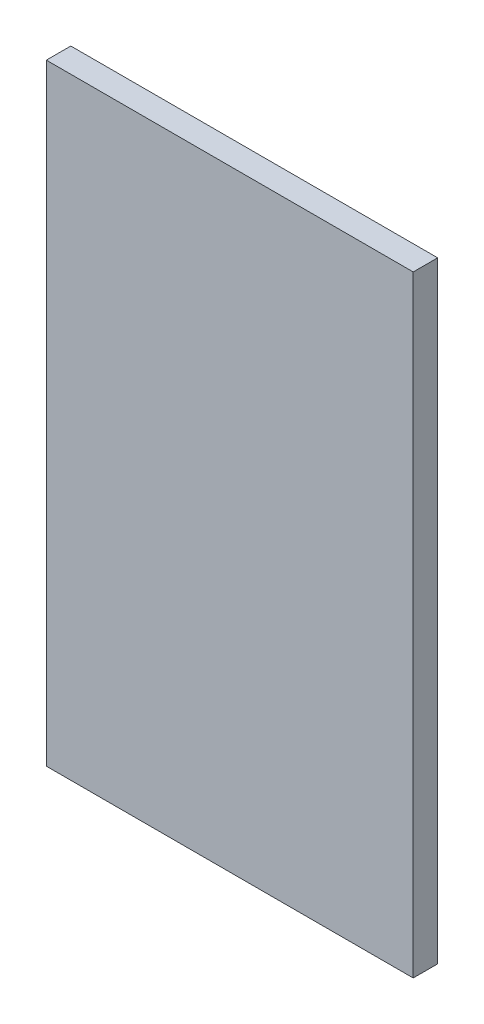
ISO-10303-21;
HEADER;
FILE_DESCRIPTION(('STEP AP214'),'2;1');
FILE_NAME('part.step','',(''),(''),'','','');
FILE_SCHEMA(('AUTOMOTIVE_DESIGN { 1 0 10303 214 1 1 1 1 }'));
ENDSEC;
DATA;
#1=APPLICATION_CONTEXT('core data for automotive mechanical design processes');
#2=APPLICATION_PROTOCOL_DEFINITION('international standard','automotive_design',2000,#1);
#3=PRODUCT_CONTEXT('',#1,'mechanical');
#4=PRODUCT('Part','Part','',(#3));
#5=PRODUCT_RELATED_PRODUCT_CATEGORY('part','',(#4));
#6=PRODUCT_DEFINITION_FORMATION('','',#4);
#7=PRODUCT_DEFINITION_CONTEXT('part definition',#1,'design');
#8=PRODUCT_DEFINITION('design','',#6,#7);
#9=PRODUCT_DEFINITION_SHAPE('','',#8);
#10=(LENGTH_UNIT() NAMED_UNIT(*) SI_UNIT(.MILLI.,.METRE.));
#11=(NAMED_UNIT(*) PLANE_ANGLE_UNIT() SI_UNIT($,.RADIAN.));
#12=(NAMED_UNIT(*) SI_UNIT($,.STERADIAN.) SOLID_ANGLE_UNIT());
#13=UNCERTAINTY_MEASURE_WITH_UNIT(LENGTH_MEASURE(1.E-05),#10,'distance_accuracy_value','');
#14=(GEOMETRIC_REPRESENTATION_CONTEXT(3) GLOBAL_UNCERTAINTY_ASSIGNED_CONTEXT((#13)) GLOBAL_UNIT_ASSIGNED_CONTEXT((#10,
#11,#12)) REPRESENTATION_CONTEXT('',''));
#15=CARTESIAN_POINT('',(0.,0.,0.));
#16=DIRECTION('',(0.,0.,1.));
#17=DIRECTION('',(1.,0.,0.));
#18=AXIS2_PLACEMENT_3D('',#15,#16,#17);
#19=CARTESIAN_POINT('',(22.5,-37.5,3.));
#20=DIRECTION('',(-1.,0.,0.));
#21=DIRECTION('',(0.,0.,1.));
#22=AXIS2_PLACEMENT_3D('',#19,#20,#21);
#23=PLANE('',#22);
#24=DIRECTION('',(0.,1.,0.));
#25=VECTOR('',#24,1.);
#26=CARTESIAN_POINT('',(22.5,-37.5,0.));
#27=LINE('',#26,#25);
#28=CARTESIAN_POINT('',(22.5,-37.5,0.));
#29=VERTEX_POINT('',#28);
#30=CARTESIAN_POINT('',(22.5,37.5,0.));
#31=VERTEX_POINT('',#30);
#32=EDGE_CURVE('E107',#29,#31,#27,.T.);
#33=ORIENTED_EDGE('',*,*,#32,.T.);
#34=DIRECTION('',(0.,0.,-1.));
#35=VECTOR('',#34,1.);
#36=CARTESIAN_POINT('',(22.5,37.5,3.));
#37=LINE('',#36,#35);
#38=CARTESIAN_POINT('',(22.5,37.5,3.));
#39=VERTEX_POINT('',#38);
#40=EDGE_CURVE('E11',#39,#31,#37,.T.);
#41=ORIENTED_EDGE('',*,*,#40,.F.);
#42=DIRECTION('',(0.,1.,0.));
#43=VECTOR('',#42,1.);
#44=CARTESIAN_POINT('',(22.5,-37.5,3.));
#45=LINE('',#44,#43);
#46=CARTESIAN_POINT('',(22.5,-37.5,3.));
#47=VERTEX_POINT('',#46);
#48=EDGE_CURVE('E91',#47,#39,#45,.T.);
#49=ORIENTED_EDGE('',*,*,#48,.F.);
#50=DIRECTION('',(0.,0.,-1.));
#51=VECTOR('',#50,1.);
#52=CARTESIAN_POINT('',(22.5,-37.5,3.));
#53=LINE('',#52,#51);
#54=EDGE_CURVE('E103',#47,#29,#53,.T.);
#55=ORIENTED_EDGE('',*,*,#54,.T.);
#56=EDGE_LOOP('',(#33,#41,#49,#55));
#57=FACE_BOUND('',#56,.T.);
#58=ADVANCED_FACE('F39',(#57),#23,.F.);
#59=CARTESIAN_POINT('',(-22.5,37.5,3.));
#60=DIRECTION('',(0.,-1.,0.));
#61=DIRECTION('',(0.,0.,-1.));
#62=AXIS2_PLACEMENT_3D('',#59,#60,#61);
#63=PLANE('',#62);
#64=DIRECTION('',(-1.,0.,0.));
#65=VECTOR('',#64,1.);
#66=CARTESIAN_POINT('',(-22.5,37.5,0.));
#67=LINE('',#66,#65);
#68=CARTESIAN_POINT('',(-22.5,37.5,0.));
#69=VERTEX_POINT('',#68);
#70=EDGE_CURVE('E96',#31,#69,#67,.T.);
#71=ORIENTED_EDGE('',*,*,#70,.T.);
#72=DIRECTION('',(0.,0.,-1.));
#73=VECTOR('',#72,1.);
#74=CARTESIAN_POINT('',(-22.5,37.5,3.));
#75=LINE('',#74,#73);
#76=CARTESIAN_POINT('',(-22.5,37.5,3.));
#77=VERTEX_POINT('',#76);
#78=EDGE_CURVE('E48',#77,#69,#75,.T.);
#79=ORIENTED_EDGE('',*,*,#78,.F.);
#80=DIRECTION('',(-1.,0.,0.));
#81=VECTOR('',#80,1.);
#82=CARTESIAN_POINT('',(-22.5,37.5,3.));
#83=LINE('',#82,#81);
#84=EDGE_CURVE('E86',#39,#77,#83,.T.);
#85=ORIENTED_EDGE('',*,*,#84,.F.);
#86=ORIENTED_EDGE('',*,*,#40,.T.);
#87=EDGE_LOOP('',(#71,#79,#85,#86));
#88=FACE_BOUND('',#87,.T.);
#89=ADVANCED_FACE('F95',(#88),#63,.F.);
#90=CARTESIAN_POINT('',(-22.5,-37.5,3.));
#91=DIRECTION('',(1.,0.,0.));
#92=DIRECTION('',(0.,0.,-1.));
#93=AXIS2_PLACEMENT_3D('',#90,#91,#92);
#94=PLANE('',#93);
#95=DIRECTION('',(0.,-1.,0.));
#96=VECTOR('',#95,1.);
#97=CARTESIAN_POINT('',(-22.5,-37.5,0.));
#98=LINE('',#97,#96);
#99=CARTESIAN_POINT('',(-22.5,-37.5,0.));
#100=VERTEX_POINT('',#99);
#101=EDGE_CURVE('E73',#69,#100,#98,.T.);
#102=ORIENTED_EDGE('',*,*,#101,.T.);
#103=DIRECTION('',(0.,0.,-1.));
#104=VECTOR('',#103,1.);
#105=CARTESIAN_POINT('',(-22.5,-37.5,3.));
#106=LINE('',#105,#104);
#107=CARTESIAN_POINT('',(-22.5,-37.5,3.));
#108=VERTEX_POINT('',#107);
#109=EDGE_CURVE('E98',#108,#100,#106,.T.);
#110=ORIENTED_EDGE('',*,*,#109,.F.);
#111=DIRECTION('',(0.,-1.,0.));
#112=VECTOR('',#111,1.);
#113=CARTESIAN_POINT('',(-22.5,-37.5,3.));
#114=LINE('',#113,#112);
#115=EDGE_CURVE('E89',#77,#108,#114,.T.);
#116=ORIENTED_EDGE('',*,*,#115,.F.);
#117=ORIENTED_EDGE('',*,*,#78,.T.);
#118=EDGE_LOOP('',(#102,#110,#116,#117));
#119=FACE_BOUND('',#118,.T.);
#120=ADVANCED_FACE('F99',(#119),#94,.F.);
#121=CARTESIAN_POINT('',(-22.5,-37.5,3.));
#122=DIRECTION('',(0.,1.,0.));
#123=DIRECTION('',(0.,0.,1.));
#124=AXIS2_PLACEMENT_3D('',#121,#122,#123);
#125=PLANE('',#124);
#126=DIRECTION('',(1.,0.,0.));
#127=VECTOR('',#126,1.);
#128=CARTESIAN_POINT('',(-22.5,-37.5,0.));
#129=LINE('',#128,#127);
#130=EDGE_CURVE('E79',#100,#29,#129,.T.);
#131=ORIENTED_EDGE('',*,*,#130,.T.);
#132=ORIENTED_EDGE('',*,*,#54,.F.);
#133=DIRECTION('',(1.,0.,0.));
#134=VECTOR('',#133,1.);
#135=CARTESIAN_POINT('',(-22.5,-37.5,3.));
#136=LINE('',#135,#134);
#137=EDGE_CURVE('E56',#108,#47,#136,.T.);
#138=ORIENTED_EDGE('',*,*,#137,.F.);
#139=ORIENTED_EDGE('',*,*,#109,.T.);
#140=EDGE_LOOP('',(#131,#132,#138,#139));
#141=FACE_BOUND('',#140,.T.);
#142=ADVANCED_FACE('F120',(#141),#125,.F.);
#143=CARTESIAN_POINT('',(0.,0.,3.));
#144=DIRECTION('',(0.,0.,-1.));
#145=DIRECTION('',(-1.,0.,0.));
#146=AXIS2_PLACEMENT_3D('',#143,#144,#145);
#147=PLANE('',#146);
#148=ORIENTED_EDGE('',*,*,#48,.T.);
#149=ORIENTED_EDGE('',*,*,#84,.T.);
#150=ORIENTED_EDGE('',*,*,#115,.T.);
#151=ORIENTED_EDGE('',*,*,#137,.T.);
#152=EDGE_LOOP('',(#148,#149,#150,#151));
#153=FACE_BOUND('',#152,.T.);
#154=ADVANCED_FACE('F87',(#153),#147,.F.);
#155=CARTESIAN_POINT('',(0.,0.,0.));
#156=DIRECTION('',(0.,0.,-1.));
#157=DIRECTION('',(-1.,0.,0.));
#158=AXIS2_PLACEMENT_3D('',#155,#156,#157);
#159=PLANE('',#158);
#160=ORIENTED_EDGE('',*,*,#32,.F.);
#161=ORIENTED_EDGE('',*,*,#130,.F.);
#162=ORIENTED_EDGE('',*,*,#101,.F.);
#163=ORIENTED_EDGE('',*,*,#70,.F.);
#164=EDGE_LOOP('',(#160,#161,#162,#163));
#165=FACE_BOUND('',#164,.T.);
#166=ADVANCED_FACE('F123',(#165),#159,.T.);
#167=CLOSED_SHELL('',(#58,#89,#120,#142,#154,#166));
#168=MANIFOLD_SOLID_BREP('B2',#167);
#169=ADVANCED_BREP_SHAPE_REPRESENTATION('',(#18,#168),#14);
#170=SHAPE_DEFINITION_REPRESENTATION(#9,#169);
ENDSEC;
END-ISO-10303-21;
